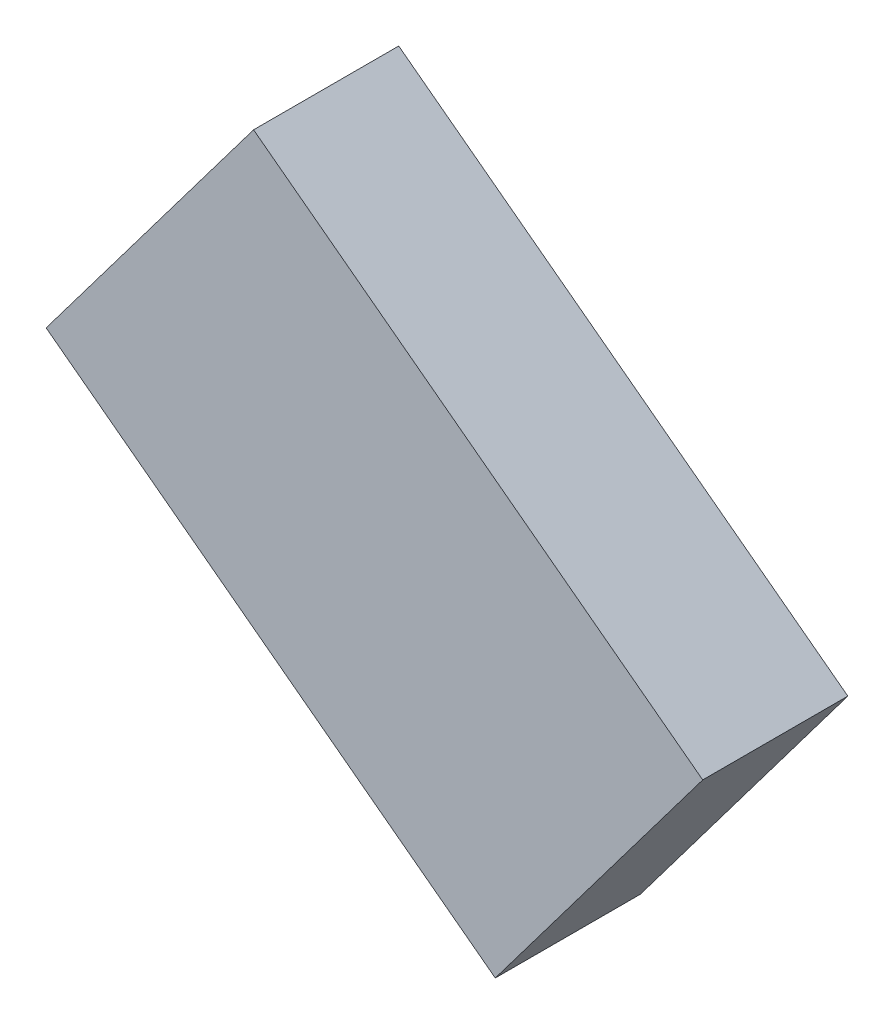
ISO-10303-21;
HEADER;
FILE_DESCRIPTION(('STEP AP214'),'2;1');
FILE_NAME('part.step','',(''),(''),'','','');
FILE_SCHEMA(('AUTOMOTIVE_DESIGN { 1 0 10303 214 1 1 1 1 }'));
ENDSEC;
DATA;
#1=APPLICATION_CONTEXT('core data for automotive mechanical design processes');
#2=APPLICATION_PROTOCOL_DEFINITION('international standard','automotive_design',2000,#1);
#3=PRODUCT_CONTEXT('',#1,'mechanical');
#4=PRODUCT('Part','Part','',(#3));
#5=PRODUCT_RELATED_PRODUCT_CATEGORY('part','',(#4));
#6=PRODUCT_DEFINITION_FORMATION('','',#4);
#7=PRODUCT_DEFINITION_CONTEXT('part definition',#1,'design');
#8=PRODUCT_DEFINITION('design','',#6,#7);
#9=PRODUCT_DEFINITION_SHAPE('','',#8);
#10=(LENGTH_UNIT() NAMED_UNIT(*) SI_UNIT(.MILLI.,.METRE.));
#11=(NAMED_UNIT(*) PLANE_ANGLE_UNIT() SI_UNIT($,.RADIAN.));
#12=(NAMED_UNIT(*) SI_UNIT($,.STERADIAN.) SOLID_ANGLE_UNIT());
#13=UNCERTAINTY_MEASURE_WITH_UNIT(LENGTH_MEASURE(1.E-05),#10,'distance_accuracy_value','');
#14=(GEOMETRIC_REPRESENTATION_CONTEXT(3) GLOBAL_UNCERTAINTY_ASSIGNED_CONTEXT((#13)) GLOBAL_UNIT_ASSIGNED_CONTEXT((#10,
#11,#12)) REPRESENTATION_CONTEXT('',''));
#15=CARTESIAN_POINT('',(0.,0.,0.));
#16=DIRECTION('',(0.,0.,1.));
#17=DIRECTION('',(1.,0.,0.));
#18=AXIS2_PLACEMENT_3D('',#15,#16,#17);
#19=CARTESIAN_POINT('',(-20.41692030426,9.904240822912,-1.661602141886));
#20=DIRECTION('',(0.,8.74227767714697E-08,-0.999999999999996));
#21=DIRECTION('',(0.,0.999999999999996,8.74227767714697E-08));
#22=AXIS2_PLACEMENT_3D('',#19,#20,#21);
#23=PLANE('',#22);
#24=DIRECTION('',(-0.601815050112246,-0.798635489731326,0.));
#25=VECTOR('',#24,1.);
#26=CARTESIAN_POINT('',(-21.65480531334,10.837054150586,-1.661602060337));
#27=LINE('',#26,#25);
#28=CARTESIAN_POINT('',(-21.6548053175424,10.8370541624937,-1.66160206033697));
#29=VERTEX_POINT('',#28);
#30=CARTESIAN_POINT('',(-21.0830810199327,11.5957578689966,-1.66160201059094));
#31=VERTEX_POINT('',#30);
#32=EDGE_CURVE('E61',#29,#31,#27,.F.);
#33=ORIENTED_EDGE('',*,*,#32,.F.);
#34=DIRECTION('',(-0.798635489731326,0.601815050112246,0.));
#35=VECTOR('',#34,1.);
#36=CARTESIAN_POINT('',(-20.41692030426,9.904240822912,-1.661602060337));
#37=LINE('',#36,#35);
#38=CARTESIAN_POINT('',(-20.4169203000582,9.90424082848797,-1.66160212149875));
#39=VERTEX_POINT('',#38);
#40=EDGE_CURVE('E56',#29,#39,#37,.F.);
#41=ORIENTED_EDGE('',*,*,#40,.T.);
#42=DIRECTION('',(-0.601815050112246,-0.798635489731326,0.));
#43=VECTOR('',#42,1.);
#44=CARTESIAN_POINT('',(-20.41692030426,9.904240822912,-1.661602141886));
#45=LINE('',#44,#43);
#46=CARTESIAN_POINT('',(-19.8451960066505,10.6629445381574,-1.66160207175276));
#47=VERTEX_POINT('',#46);
#48=EDGE_CURVE('E20',#39,#47,#45,.F.);
#49=ORIENTED_EDGE('',*,*,#48,.T.);
#50=DIRECTION('',(-0.798635489731326,0.601815050112246,0.));
#51=VECTOR('',#50,1.);
#52=CARTESIAN_POINT('',(-19.84519600665,10.662944538157,-1.661601994009));
#53=LINE('',#52,#51);
#54=EDGE_CURVE('E79',#31,#47,#53,.F.);
#55=ORIENTED_EDGE('',*,*,#54,.F.);
#56=EDGE_LOOP('',(#33,#41,#49,#55));
#57=FACE_BOUND('',#56,.T.);
#58=ADVANCED_FACE('F17',(#57),#23,.F.);
#59=CARTESIAN_POINT('',(-20.41692030426,9.904240822912,-1.661602141886));
#60=DIRECTION('',(-0.798635489731325,0.601815050112245,5.26123433841814E-08));
#61=DIRECTION('',(-0.601815050112246,-0.798635489731326,0.));
#62=AXIS2_PLACEMENT_3D('',#59,#60,#61);
#63=PLANE('',#62);
#64=DIRECTION('',(-4.20180838726443E-08,-5.57598767012264E-08,0.999999999999998));
#65=VECTOR('',#64,1.);
#66=CARTESIAN_POINT('',(-19.84519600665,10.662944538157,-1.661602075558));
#67=LINE('',#66,#65);
#68=CARTESIAN_POINT('',(-19.8451960108528,10.6629445588086,-2.061602075558));
#69=VERTEX_POINT('',#68);
#70=EDGE_CURVE('E68',#47,#69,#67,.F.);
#71=ORIENTED_EDGE('',*,*,#70,.F.);
#72=ORIENTED_EDGE('',*,*,#48,.F.);
#73=DIRECTION('',(-4.20180838726443E-08,-5.57598767012264E-08,0.999999999999998));
#74=VECTOR('',#73,1.);
#75=CARTESIAN_POINT('',(-20.41692030426,9.904240822912,-1.661602141886));
#76=LINE('',#75,#74);
#77=CARTESIAN_POINT('',(-20.4169203000582,9.90424085471476,-2.061602108722));
#78=VERTEX_POINT('',#77);
#79=EDGE_CURVE('E63',#39,#78,#76,.F.);
#80=ORIENTED_EDGE('',*,*,#79,.T.);
#81=DIRECTION('',(-0.601815050114384,-0.798635489729712,-6.98189317944921E-08));
#82=VECTOR('',#81,1.);
#83=CARTESIAN_POINT('',(-19.84519600665,10.662944573126,-2.06160207555801));
#84=LINE('',#83,#82);
#85=EDGE_CURVE('E83',#69,#78,#84,.T.);
#86=ORIENTED_EDGE('',*,*,#85,.F.);
#87=EDGE_LOOP('',(#71,#72,#80,#86));
#88=FACE_BOUND('',#87,.T.);
#89=ADVANCED_FACE('F65',(#88),#63,.F.);
#90=CARTESIAN_POINT('',(-20.41692030426,9.904240822912,-1.661602141886));
#91=DIRECTION('',(0.601815050112244,0.798635489731324,6.98189316880783E-08));
#92=DIRECTION('',(-0.798635489731326,0.601815050112246,0.));
#93=AXIS2_PLACEMENT_3D('',#90,#91,#92);
#94=PLANE('',#93);
#95=DIRECTION('',(-0.798635489730488,0.601815050113356,5.26123432455874E-08));
#96=VECTOR('',#95,1.);
#97=CARTESIAN_POINT('',(-20.41692030426,9.904240857881,-2.061602141886));
#98=LINE('',#97,#96);
#99=CARTESIAN_POINT('',(-21.6548053133406,10.8370541855542,-2.06160208452947));
#100=VERTEX_POINT('',#99);
#101=EDGE_CURVE('E72',#78,#100,#98,.T.);
#102=ORIENTED_EDGE('',*,*,#101,.F.);
#103=ORIENTED_EDGE('',*,*,#79,.F.);
#104=ORIENTED_EDGE('',*,*,#40,.F.);
#105=DIRECTION('',(4.20180846245384E-08,-3.16629000702738E-08,0.999999999999999));
#106=VECTOR('',#105,1.);
#107=CARTESIAN_POINT('',(-21.6548052965328,10.8370541728899,-1.661602060337));
#108=LINE('',#107,#106);
#109=EDGE_CURVE('E74',#100,#29,#108,.T.);
#110=ORIENTED_EDGE('',*,*,#109,.F.);
#111=EDGE_LOOP('',(#102,#103,#104,#110));
#112=FACE_BOUND('',#111,.T.);
#113=ADVANCED_FACE('F70',(#112),#94,.F.);
#114=CARTESIAN_POINT('',(-21.65480531334,10.837054150586,-1.661602060337));
#115=DIRECTION('',(-0.798635489731325,0.601815050112245,5.26123433841814E-08));
#116=DIRECTION('',(-0.601815050112246,-0.798635489731326,0.));
#117=AXIS2_PLACEMENT_3D('',#114,#115,#116);
#118=PLANE('',#117);
#119=DIRECTION('',(-4.20180838726443E-08,-5.57598767012264E-08,0.999999999999998));
#120=VECTOR('',#119,1.);
#121=CARTESIAN_POINT('',(-21.0830810325385,11.5957578784944,-1.661602075558));
#122=LINE('',#121,#120);
#123=CARTESIAN_POINT('',(-21.0830810241352,11.5957578896481,-2.06160201439622));
#124=VERTEX_POINT('',#123);
#125=EDGE_CURVE('E35',#124,#31,#122,.T.);
#126=ORIENTED_EDGE('',*,*,#125,.F.);
#127=DIRECTION('',(0.601815050114382,0.798635489729713,6.98189317944922E-08));
#128=VECTOR('',#127,1.);
#129=CARTESIAN_POINT('',(-21.65480531334,10.837054185555,-2.06160206033687));
#130=LINE('',#129,#128);
#131=EDGE_CURVE('E26',#100,#124,#130,.T.);
#132=ORIENTED_EDGE('',*,*,#131,.F.);
#133=ORIENTED_EDGE('',*,*,#109,.T.);
#134=ORIENTED_EDGE('',*,*,#32,.T.);
#135=EDGE_LOOP('',(#126,#132,#133,#134));
#136=FACE_BOUND('',#135,.T.);
#137=ADVANCED_FACE('F89',(#136),#118,.T.);
#138=CARTESIAN_POINT('',(-19.84519600665,10.662944538157,-1.661602075558));
#139=DIRECTION('',(0.601815050112244,0.798635489731324,6.98189316880783E-08));
#140=DIRECTION('',(-0.798635489731326,0.601815050112246,0.));
#141=AXIS2_PLACEMENT_3D('',#138,#139,#140);
#142=PLANE('',#141);
#143=DIRECTION('',(0.798635489730489,-0.601815050113355,-5.26123432455873E-08));
#144=VECTOR('',#143,1.);
#145=CARTESIAN_POINT('',(-21.08308101573,11.5957579008,-2.06160199400888));
#146=LINE('',#145,#144);
#147=EDGE_CURVE('E11',#124,#69,#146,.T.);
#148=ORIENTED_EDGE('',*,*,#147,.F.);
#149=ORIENTED_EDGE('',*,*,#125,.T.);
#150=ORIENTED_EDGE('',*,*,#54,.T.);
#151=ORIENTED_EDGE('',*,*,#70,.T.);
#152=EDGE_LOOP('',(#148,#149,#150,#151));
#153=FACE_BOUND('',#152,.T.);
#154=ADVANCED_FACE('F91',(#153),#142,.T.);
#155=CARTESIAN_POINT('',(-20.41692030426,9.904240857881,-2.061602141886));
#156=DIRECTION('',(0.,8.74227767714697E-08,-0.999999999999996));
#157=DIRECTION('',(0.,0.999999999999996,8.74227767714697E-08));
#158=AXIS2_PLACEMENT_3D('',#155,#156,#157);
#159=PLANE('',#158);
#160=ORIENTED_EDGE('',*,*,#131,.T.);
#161=ORIENTED_EDGE('',*,*,#147,.T.);
#162=ORIENTED_EDGE('',*,*,#85,.T.);
#163=ORIENTED_EDGE('',*,*,#101,.T.);
#164=EDGE_LOOP('',(#160,#161,#162,#163));
#165=FACE_BOUND('',#164,.T.);
#166=ADVANCED_FACE('F88',(#165),#159,.T.);
#167=CLOSED_SHELL('',(#58,#89,#113,#137,#154,#166));
#168=MANIFOLD_SOLID_BREP('B1',#167);
#169=ADVANCED_BREP_SHAPE_REPRESENTATION('',(#18,#168),#14);
#170=SHAPE_DEFINITION_REPRESENTATION(#9,#169);
ENDSEC;
END-ISO-10303-21;
